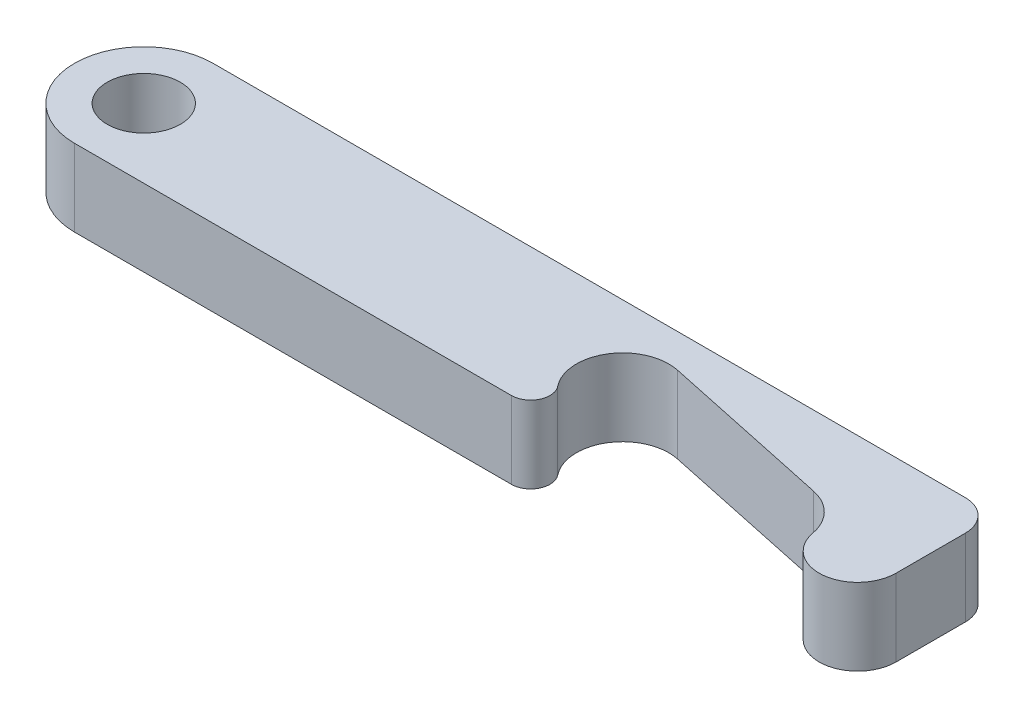
ISO-10303-21;
HEADER;
FILE_DESCRIPTION(('STEP AP214'),'2;1');
FILE_NAME('part.step','',(''),(''),'','','');
FILE_SCHEMA(('AUTOMOTIVE_DESIGN { 1 0 10303 214 1 1 1 1 }'));
ENDSEC;
DATA;
#1=APPLICATION_CONTEXT('core data for automotive mechanical design processes');
#2=APPLICATION_PROTOCOL_DEFINITION('international standard','automotive_design',2000,#1);
#3=PRODUCT_CONTEXT('',#1,'mechanical');
#4=PRODUCT('Part','Part','',(#3));
#5=PRODUCT_RELATED_PRODUCT_CATEGORY('part','',(#4));
#6=PRODUCT_DEFINITION_FORMATION('','',#4);
#7=PRODUCT_DEFINITION_CONTEXT('part definition',#1,'design');
#8=PRODUCT_DEFINITION('design','',#6,#7);
#9=PRODUCT_DEFINITION_SHAPE('','',#8);
#10=(LENGTH_UNIT() NAMED_UNIT(*) SI_UNIT(.MILLI.,.METRE.));
#11=(NAMED_UNIT(*) PLANE_ANGLE_UNIT() SI_UNIT($,.RADIAN.));
#12=(NAMED_UNIT(*) SI_UNIT($,.STERADIAN.) SOLID_ANGLE_UNIT());
#13=UNCERTAINTY_MEASURE_WITH_UNIT(LENGTH_MEASURE(1.E-05),#10,'distance_accuracy_value','');
#14=(GEOMETRIC_REPRESENTATION_CONTEXT(3) GLOBAL_UNCERTAINTY_ASSIGNED_CONTEXT((#13)) GLOBAL_UNIT_ASSIGNED_CONTEXT((#10,
#11,#12)) REPRESENTATION_CONTEXT('',''));
#15=CARTESIAN_POINT('',(0.,0.,0.));
#16=DIRECTION('',(0.,0.,1.));
#17=DIRECTION('',(1.,0.,0.));
#18=AXIS2_PLACEMENT_3D('',#15,#16,#17);
#19=CARTESIAN_POINT('',(0.,10.,8.99999999999999));
#20=DIRECTION('',(0.,0.,1.));
#21=DIRECTION('',(1.,0.,0.));
#22=AXIS2_PLACEMENT_3D('',#19,#20,#21);
#23=PLANE('',#22);
#24=DIRECTION('',(-1.,0.,0.));
#25=VECTOR('',#24,1.);
#26=CARTESIAN_POINT('',(0.,0.,8.99999999999999));
#27=LINE('',#26,#25);
#28=CARTESIAN_POINT('',(6.28199505871916,0.,8.99999999999999));
#29=VERTEX_POINT('',#28);
#30=CARTESIAN_POINT('',(-50.5,0.,9.));
#31=VERTEX_POINT('',#30);
#32=EDGE_CURVE('E150',#29,#31,#27,.T.);
#33=ORIENTED_EDGE('',*,*,#32,.F.);
#34=DIRECTION('',(0.,-1.,0.));
#35=VECTOR('',#34,1.);
#36=CARTESIAN_POINT('',(6.28199505871916,10.,8.99999999999999));
#37=LINE('',#36,#35);
#38=CARTESIAN_POINT('',(6.28199505871916,10.,8.99999999999999));
#39=VERTEX_POINT('',#38);
#40=EDGE_CURVE('E11',#39,#29,#37,.T.);
#41=ORIENTED_EDGE('',*,*,#40,.F.);
#42=DIRECTION('',(-1.,0.,0.));
#43=VECTOR('',#42,1.);
#44=CARTESIAN_POINT('',(0.,10.,8.99999999999999));
#45=LINE('',#44,#43);
#46=CARTESIAN_POINT('',(-50.5,10.,9.));
#47=VERTEX_POINT('',#46);
#48=EDGE_CURVE('E213',#39,#47,#45,.T.);
#49=ORIENTED_EDGE('',*,*,#48,.T.);
#50=DIRECTION('',(0.,-1.,0.));
#51=VECTOR('',#50,1.);
#52=CARTESIAN_POINT('',(-50.5,10.,9.));
#53=LINE('',#52,#51);
#54=EDGE_CURVE('E98',#47,#31,#53,.T.);
#55=ORIENTED_EDGE('',*,*,#54,.T.);
#56=EDGE_LOOP('',(#33,#41,#49,#55));
#57=FACE_BOUND('',#56,.T.);
#58=ADVANCED_FACE('F41',(#57),#23,.T.);
#59=CARTESIAN_POINT('',(6.28199505871916,10.,6.49999999999999));
#60=DIRECTION('',(0.,-1.,0.));
#61=DIRECTION('',(0.,0.,-1.));
#62=AXIS2_PLACEMENT_3D('',#59,#60,#61);
#63=CYLINDRICAL_SURFACE('',#62,2.5);
#64=CARTESIAN_POINT('',(6.28199505871916,0.,6.49999999999999));
#65=DIRECTION('',(0.,1.,0.));
#66=DIRECTION('',(0.,0.,1.));
#67=AXIS2_PLACEMENT_3D('',#64,#65,#66);
#68=CIRCLE('',#67,2.5);
#69=CARTESIAN_POINT('',(8.24058351360121,0.,4.94631687130137));
#70=VERTEX_POINT('',#69);
#71=EDGE_CURVE('E153',#29,#70,#68,.T.);
#72=ORIENTED_EDGE('',*,*,#71,.T.);
#73=DIRECTION('',(0.,-1.,0.));
#74=VECTOR('',#73,1.);
#75=CARTESIAN_POINT('',(8.24058351360121,10.,4.94631687130137));
#76=LINE('',#75,#74);
#77=CARTESIAN_POINT('',(8.24058351360121,10.,4.94631687130137));
#78=VERTEX_POINT('',#77);
#79=EDGE_CURVE('E50',#78,#70,#76,.T.);
#80=ORIENTED_EDGE('',*,*,#79,.F.);
#81=CARTESIAN_POINT('',(6.28199505871916,10.,6.49999999999999));
#82=DIRECTION('',(0.,1.,0.));
#83=DIRECTION('',(0.,0.,1.));
#84=AXIS2_PLACEMENT_3D('',#81,#82,#83);
#85=CIRCLE('',#84,2.5);
#86=EDGE_CURVE('E211',#39,#78,#85,.T.);
#87=ORIENTED_EDGE('',*,*,#86,.F.);
#88=ORIENTED_EDGE('',*,*,#40,.T.);
#89=EDGE_LOOP('',(#72,#80,#87,#88));
#90=FACE_BOUND('',#89,.T.);
#91=ADVANCED_FACE('F196',(#90),#63,.T.);
#92=CARTESIAN_POINT('',(12.9411958053181,10.,1.21747736242467));
#93=DIRECTION('',(0.,-1.,0.));
#94=DIRECTION('',(0.,0.,-1.));
#95=AXIS2_PLACEMENT_3D('',#92,#93,#94);
#96=CYLINDRICAL_SURFACE('',#95,6.);
#97=CARTESIAN_POINT('',(12.9411958053181,0.,1.21747736242467));
#98=DIRECTION('',(0.,1.,0.));
#99=DIRECTION('',(0.,0.,1.));
#100=AXIS2_PLACEMENT_3D('',#97,#98,#99);
#101=CIRCLE('',#100,6.);
#102=CARTESIAN_POINT('',(14.1886659502246,0.,-4.65140824197817));
#103=VERTEX_POINT('',#102);
#104=EDGE_CURVE('E156',#103,#70,#101,.T.);
#105=ORIENTED_EDGE('',*,*,#104,.F.);
#106=DIRECTION('',(0.,-1.,0.));
#107=VECTOR('',#106,1.);
#108=CARTESIAN_POINT('',(14.1886659502246,10.,-4.65140824197817));
#109=LINE('',#108,#107);
#110=CARTESIAN_POINT('',(14.1886659502246,10.,-4.65140824197817));
#111=VERTEX_POINT('',#110);
#112=EDGE_CURVE('E186',#111,#103,#109,.T.);
#113=ORIENTED_EDGE('',*,*,#112,.F.);
#114=CARTESIAN_POINT('',(12.9411958053181,10.,1.21747736242467));
#115=DIRECTION('',(0.,1.,0.));
#116=DIRECTION('',(0.,0.,1.));
#117=AXIS2_PLACEMENT_3D('',#114,#115,#116);
#118=CIRCLE('',#117,6.);
#119=EDGE_CURVE('E193',#111,#78,#118,.T.);
#120=ORIENTED_EDGE('',*,*,#119,.T.);
#121=ORIENTED_EDGE('',*,*,#79,.T.);
#122=EDGE_LOOP('',(#105,#113,#120,#121));
#123=FACE_BOUND('',#122,.T.);
#124=ADVANCED_FACE('F191',(#123),#96,.F.);
#125=CARTESIAN_POINT('',(1.55928639765293,10.,-7.3358657356984));
#126=DIRECTION('',(0.207911690817752,0.,-0.978147600733807));
#127=DIRECTION('',(-0.978147600733807,0.,-0.207911690817752));
#128=AXIS2_PLACEMENT_3D('',#125,#126,#127);
#129=PLANE('',#128);
#130=DIRECTION('',(0.978147600733807,0.,0.207911690817752));
#131=VECTOR('',#130,1.);
#132=CARTESIAN_POINT('',(1.55928639765293,0.,-7.3358657356984));
#133=LINE('',#132,#131);
#134=CARTESIAN_POINT('',(36.6886659502246,0.,0.131114395597161));
#135=VERTEX_POINT('',#134);
#136=EDGE_CURVE('E159',#103,#135,#133,.T.);
#137=ORIENTED_EDGE('',*,*,#136,.T.);
#138=DIRECTION('',(0.,-1.,0.));
#139=VECTOR('',#138,1.);
#140=CARTESIAN_POINT('',(36.6886659502246,10.,0.131114395597161));
#141=LINE('',#140,#139);
#142=CARTESIAN_POINT('',(36.6886659502246,10.,0.131114395597161));
#143=VERTEX_POINT('',#142);
#144=EDGE_CURVE('E184',#143,#135,#141,.T.);
#145=ORIENTED_EDGE('',*,*,#144,.F.);
#146=DIRECTION('',(0.978147600733807,0.,0.207911690817752));
#147=VECTOR('',#146,1.);
#148=CARTESIAN_POINT('',(1.55928639765293,10.,-7.3358657356984));
#149=LINE('',#148,#147);
#150=EDGE_CURVE('E207',#111,#143,#149,.T.);
#151=ORIENTED_EDGE('',*,*,#150,.F.);
#152=ORIENTED_EDGE('',*,*,#112,.T.);
#153=EDGE_LOOP('',(#137,#145,#151,#152));
#154=FACE_BOUND('',#153,.T.);
#155=ADVANCED_FACE('F204',(#154),#129,.F.);
#156=CARTESIAN_POINT('',(35.4411958053181,10.,6.));
#157=DIRECTION('',(0.,-1.,0.));
#158=DIRECTION('',(0.,0.,-1.));
#159=AXIS2_PLACEMENT_3D('',#156,#157,#158);
#160=CYLINDRICAL_SURFACE('',#159,6.);
#161=CARTESIAN_POINT('',(35.4411958053181,0.,6.));
#162=DIRECTION('',(0.,1.,0.));
#163=DIRECTION('',(0.,0.,1.));
#164=AXIS2_PLACEMENT_3D('',#161,#162,#163);
#165=CIRCLE('',#164,6.);
#166=CARTESIAN_POINT('',(41.3411888015319,0.,4.9090909090909));
#167=VERTEX_POINT('',#166);
#168=EDGE_CURVE('E162',#167,#135,#165,.T.);
#169=ORIENTED_EDGE('',*,*,#168,.F.);
#170=DIRECTION('',(0.,-1.,0.));
#171=VECTOR('',#170,1.);
#172=CARTESIAN_POINT('',(41.3411888015319,10.,4.9090909090909));
#173=LINE('',#172,#171);
#174=CARTESIAN_POINT('',(41.3411888015319,10.,4.9090909090909));
#175=VERTEX_POINT('',#174);
#176=EDGE_CURVE('E182',#175,#167,#173,.T.);
#177=ORIENTED_EDGE('',*,*,#176,.F.);
#178=CARTESIAN_POINT('',(35.4411958053181,10.,6.));
#179=DIRECTION('',(0.,1.,0.));
#180=DIRECTION('',(0.,0.,1.));
#181=AXIS2_PLACEMENT_3D('',#178,#179,#180);
#182=CIRCLE('',#181,6.);
#183=EDGE_CURVE('E209',#175,#143,#182,.T.);
#184=ORIENTED_EDGE('',*,*,#183,.T.);
#185=ORIENTED_EDGE('',*,*,#144,.T.);
#186=EDGE_LOOP('',(#169,#177,#184,#185));
#187=FACE_BOUND('',#186,.T.);
#188=ADVANCED_FACE('F249',(#187),#160,.F.);
#189=CARTESIAN_POINT('',(46.2578496317101,10.,3.99999999999999));
#190=DIRECTION('',(0.,-1.,0.));
#191=DIRECTION('',(0.,0.,-1.));
#192=AXIS2_PLACEMENT_3D('',#189,#190,#191);
#193=CYLINDRICAL_SURFACE('',#192,5.);
#194=CARTESIAN_POINT('',(46.2578496317101,0.,3.99999999999999));
#195=DIRECTION('',(0.,1.,0.));
#196=DIRECTION('',(0.,0.,1.));
#197=AXIS2_PLACEMENT_3D('',#194,#195,#196);
#198=CIRCLE('',#197,5.);
#199=CARTESIAN_POINT('',(51.2578496317101,0.,3.99999999999999));
#200=VERTEX_POINT('',#199);
#201=EDGE_CURVE('E165',#167,#200,#198,.T.);
#202=ORIENTED_EDGE('',*,*,#201,.T.);
#203=DIRECTION('',(0.,-1.,0.));
#204=VECTOR('',#203,1.);
#205=CARTESIAN_POINT('',(51.2578496317101,10.,3.99999999999999));
#206=LINE('',#205,#204);
#207=CARTESIAN_POINT('',(51.2578496317101,10.,3.99999999999999));
#208=VERTEX_POINT('',#207);
#209=EDGE_CURVE('E180',#208,#200,#206,.T.);
#210=ORIENTED_EDGE('',*,*,#209,.F.);
#211=CARTESIAN_POINT('',(46.2578496317101,10.,3.99999999999999));
#212=DIRECTION('',(0.,1.,0.));
#213=DIRECTION('',(0.,0.,1.));
#214=AXIS2_PLACEMENT_3D('',#211,#212,#213);
#215=CIRCLE('',#214,5.);
#216=EDGE_CURVE('E218',#175,#208,#215,.T.);
#217=ORIENTED_EDGE('',*,*,#216,.F.);
#218=ORIENTED_EDGE('',*,*,#176,.T.);
#219=EDGE_LOOP('',(#202,#210,#217,#218));
#220=FACE_BOUND('',#219,.T.);
#221=ADVANCED_FACE('F252',(#220),#193,.T.);
#222=CARTESIAN_POINT('',(51.2578496317101,10.,0.));
#223=DIRECTION('',(1.,0.,0.));
#224=DIRECTION('',(0.,0.,-1.));
#225=AXIS2_PLACEMENT_3D('',#222,#223,#224);
#226=PLANE('',#225);
#227=DIRECTION('',(0.,0.,1.));
#228=VECTOR('',#227,1.);
#229=CARTESIAN_POINT('',(51.2578496317101,0.,0.));
#230=LINE('',#229,#228);
#231=CARTESIAN_POINT('',(51.2578496317101,0.,-5.));
#232=VERTEX_POINT('',#231);
#233=EDGE_CURVE('E168',#232,#200,#230,.T.);
#234=ORIENTED_EDGE('',*,*,#233,.F.);
#235=DIRECTION('',(0.,-1.,0.));
#236=VECTOR('',#235,1.);
#237=CARTESIAN_POINT('',(51.2578496317101,10.,-5.));
#238=LINE('',#237,#236);
#239=CARTESIAN_POINT('',(51.2578496317101,10.,-5.));
#240=VERTEX_POINT('',#239);
#241=EDGE_CURVE('E140',#240,#232,#238,.T.);
#242=ORIENTED_EDGE('',*,*,#241,.F.);
#243=DIRECTION('',(0.,0.,1.));
#244=VECTOR('',#243,1.);
#245=CARTESIAN_POINT('',(51.2578496317101,10.,0.));
#246=LINE('',#245,#244);
#247=EDGE_CURVE('E129',#240,#208,#246,.T.);
#248=ORIENTED_EDGE('',*,*,#247,.T.);
#249=ORIENTED_EDGE('',*,*,#209,.T.);
#250=EDGE_LOOP('',(#234,#242,#248,#249));
#251=FACE_BOUND('',#250,.T.);
#252=ADVANCED_FACE('F221',(#251),#226,.T.);
#253=CARTESIAN_POINT('',(47.2578496317101,10.,-5.));
#254=DIRECTION('',(0.,-1.,0.));
#255=DIRECTION('',(0.,0.,-1.));
#256=AXIS2_PLACEMENT_3D('',#253,#254,#255);
#257=CYLINDRICAL_SURFACE('',#256,4.);
#258=CARTESIAN_POINT('',(47.2578496317101,0.,-5.));
#259=DIRECTION('',(0.,1.,0.));
#260=DIRECTION('',(0.,0.,1.));
#261=AXIS2_PLACEMENT_3D('',#258,#259,#260);
#262=CIRCLE('',#261,4.);
#263=CARTESIAN_POINT('',(47.2578496317101,0.,-9.));
#264=VERTEX_POINT('',#263);
#265=EDGE_CURVE('E136',#232,#264,#262,.T.);
#266=ORIENTED_EDGE('',*,*,#265,.T.);
#267=DIRECTION('',(0.,-1.,0.));
#268=VECTOR('',#267,1.);
#269=CARTESIAN_POINT('',(47.2578496317101,10.,-9.));
#270=LINE('',#269,#268);
#271=CARTESIAN_POINT('',(47.2578496317101,10.,-9.));
#272=VERTEX_POINT('',#271);
#273=EDGE_CURVE('E133',#272,#264,#270,.T.);
#274=ORIENTED_EDGE('',*,*,#273,.F.);
#275=CARTESIAN_POINT('',(47.2578496317101,10.,-5.));
#276=DIRECTION('',(0.,1.,0.));
#277=DIRECTION('',(0.,0.,1.));
#278=AXIS2_PLACEMENT_3D('',#275,#276,#277);
#279=CIRCLE('',#278,4.);
#280=EDGE_CURVE('E123',#240,#272,#279,.T.);
#281=ORIENTED_EDGE('',*,*,#280,.F.);
#282=ORIENTED_EDGE('',*,*,#241,.T.);
#283=EDGE_LOOP('',(#266,#274,#281,#282));
#284=FACE_BOUND('',#283,.T.);
#285=ADVANCED_FACE('F134',(#284),#257,.T.);
#286=CARTESIAN_POINT('',(0.,10.,-9.));
#287=DIRECTION('',(0.,0.,-1.));
#288=DIRECTION('',(-1.,0.,0.));
#289=AXIS2_PLACEMENT_3D('',#286,#287,#288);
#290=PLANE('',#289);
#291=DIRECTION('',(1.,0.,0.));
#292=VECTOR('',#291,1.);
#293=CARTESIAN_POINT('',(0.,0.,-9.));
#294=LINE('',#293,#292);
#295=CARTESIAN_POINT('',(-50.5,0.,-9.));
#296=VERTEX_POINT('',#295);
#297=EDGE_CURVE('E172',#296,#264,#294,.T.);
#298=ORIENTED_EDGE('',*,*,#297,.F.);
#299=DIRECTION('',(0.,-1.,0.));
#300=VECTOR('',#299,1.);
#301=CARTESIAN_POINT('',(-50.5,10.,-9.));
#302=LINE('',#301,#300);
#303=CARTESIAN_POINT('',(-50.5,10.,-9.));
#304=VERTEX_POINT('',#303);
#305=EDGE_CURVE('E91',#304,#296,#302,.T.);
#306=ORIENTED_EDGE('',*,*,#305,.F.);
#307=DIRECTION('',(1.,0.,0.));
#308=VECTOR('',#307,1.);
#309=CARTESIAN_POINT('',(0.,10.,-9.));
#310=LINE('',#309,#308);
#311=EDGE_CURVE('E127',#304,#272,#310,.T.);
#312=ORIENTED_EDGE('',*,*,#311,.T.);
#313=ORIENTED_EDGE('',*,*,#273,.T.);
#314=EDGE_LOOP('',(#298,#306,#312,#313));
#315=FACE_BOUND('',#314,.T.);
#316=ADVANCED_FACE('F142',(#315),#290,.T.);
#317=CARTESIAN_POINT('',(-50.5,10.,0.));
#318=DIRECTION('',(0.,-1.,0.));
#319=DIRECTION('',(0.,0.,-1.));
#320=AXIS2_PLACEMENT_3D('',#317,#318,#319);
#321=CYLINDRICAL_SURFACE('',#320,4.75);
#322=CARTESIAN_POINT('',(-50.5,10.,0.));
#323=DIRECTION('',(0.,1.,0.));
#324=DIRECTION('',(0.,0.,1.));
#325=AXIS2_PLACEMENT_3D('',#322,#323,#324);
#326=CIRCLE('',#325,4.75);
#327=CARTESIAN_POINT('',(-50.5,10.,4.75));
#328=VERTEX_POINT('',#327);
#329=EDGE_CURVE('E176',#328,#328,#326,.T.);
#330=ORIENTED_EDGE('',*,*,#329,.T.);
#331=EDGE_LOOP('',(#330));
#332=FACE_BOUND('',#331,.T.);
#333=CARTESIAN_POINT('',(-50.5,0.,0.));
#334=DIRECTION('',(0.,1.,0.));
#335=DIRECTION('',(0.,0.,1.));
#336=AXIS2_PLACEMENT_3D('',#333,#334,#335);
#337=CIRCLE('',#336,4.75);
#338=CARTESIAN_POINT('',(-50.5,0.,4.75));
#339=VERTEX_POINT('',#338);
#340=EDGE_CURVE('E147',#339,#339,#337,.T.);
#341=ORIENTED_EDGE('',*,*,#340,.F.);
#342=EDGE_LOOP('',(#341));
#343=FACE_BOUND('',#342,.T.);
#344=ADVANCED_FACE('F43',(#332,#343),#321,.F.);
#345=CARTESIAN_POINT('',(-50.5,10.,0.));
#346=DIRECTION('',(0.,-1.,0.));
#347=DIRECTION('',(0.,0.,-1.));
#348=AXIS2_PLACEMENT_3D('',#345,#346,#347);
#349=CYLINDRICAL_SURFACE('',#348,9.);
#350=CARTESIAN_POINT('',(-50.5,0.,0.));
#351=DIRECTION('',(0.,1.,0.));
#352=DIRECTION('',(0.,0.,1.));
#353=AXIS2_PLACEMENT_3D('',#350,#351,#352);
#354=CIRCLE('',#353,9.);
#355=EDGE_CURVE('E174',#296,#31,#354,.T.);
#356=ORIENTED_EDGE('',*,*,#355,.T.);
#357=ORIENTED_EDGE('',*,*,#54,.F.);
#358=CARTESIAN_POINT('',(-50.5,10.,0.));
#359=DIRECTION('',(0.,1.,0.));
#360=DIRECTION('',(0.,0.,1.));
#361=AXIS2_PLACEMENT_3D('',#358,#359,#360);
#362=CIRCLE('',#361,9.);
#363=EDGE_CURVE('E58',#304,#47,#362,.T.);
#364=ORIENTED_EDGE('',*,*,#363,.F.);
#365=ORIENTED_EDGE('',*,*,#305,.T.);
#366=EDGE_LOOP('',(#356,#357,#364,#365));
#367=FACE_BOUND('',#366,.T.);
#368=ADVANCED_FACE('F223',(#367),#349,.T.);
#369=CARTESIAN_POINT('',(0.,10.,0.));
#370=DIRECTION('',(0.,1.,0.));
#371=DIRECTION('',(0.,0.,1.));
#372=AXIS2_PLACEMENT_3D('',#369,#370,#371);
#373=PLANE('',#372);
#374=ORIENTED_EDGE('',*,*,#329,.F.);
#375=EDGE_LOOP('',(#374));
#376=FACE_BOUND('',#375,.T.);
#377=ORIENTED_EDGE('',*,*,#48,.F.);
#378=ORIENTED_EDGE('',*,*,#86,.T.);
#379=ORIENTED_EDGE('',*,*,#119,.F.);
#380=ORIENTED_EDGE('',*,*,#150,.T.);
#381=ORIENTED_EDGE('',*,*,#183,.F.);
#382=ORIENTED_EDGE('',*,*,#216,.T.);
#383=ORIENTED_EDGE('',*,*,#247,.F.);
#384=ORIENTED_EDGE('',*,*,#280,.T.);
#385=ORIENTED_EDGE('',*,*,#311,.F.);
#386=ORIENTED_EDGE('',*,*,#363,.T.);
#387=EDGE_LOOP('',(#377,#378,#379,#380,#381,#382,#383,#384,#385,#386));
#388=FACE_BOUND('',#387,.T.);
#389=ADVANCED_FACE('F125',(#376,#388),#373,.T.);
#390=CARTESIAN_POINT('',(0.,0.,0.));
#391=DIRECTION('',(0.,1.,0.));
#392=DIRECTION('',(0.,0.,1.));
#393=AXIS2_PLACEMENT_3D('',#390,#391,#392);
#394=PLANE('',#393);
#395=ORIENTED_EDGE('',*,*,#340,.T.);
#396=EDGE_LOOP('',(#395));
#397=FACE_BOUND('',#396,.T.);
#398=ORIENTED_EDGE('',*,*,#32,.T.);
#399=ORIENTED_EDGE('',*,*,#355,.F.);
#400=ORIENTED_EDGE('',*,*,#297,.T.);
#401=ORIENTED_EDGE('',*,*,#265,.F.);
#402=ORIENTED_EDGE('',*,*,#233,.T.);
#403=ORIENTED_EDGE('',*,*,#201,.F.);
#404=ORIENTED_EDGE('',*,*,#168,.T.);
#405=ORIENTED_EDGE('',*,*,#136,.F.);
#406=ORIENTED_EDGE('',*,*,#104,.T.);
#407=ORIENTED_EDGE('',*,*,#71,.F.);
#408=EDGE_LOOP('',(#398,#399,#400,#401,#402,#403,#404,#405,#406,#407));
#409=FACE_BOUND('',#408,.T.);
#410=ADVANCED_FACE('F199',(#397,#409),#394,.F.);
#411=CLOSED_SHELL('',(#58,#91,#124,#155,#188,#221,#252,#285,#316,#344,#368,#389,#410));
#412=MANIFOLD_SOLID_BREP('B2',#411);
#413=ADVANCED_BREP_SHAPE_REPRESENTATION('',(#18,#412),#14);
#414=SHAPE_DEFINITION_REPRESENTATION(#9,#413);
ENDSEC;
END-ISO-10303-21;
